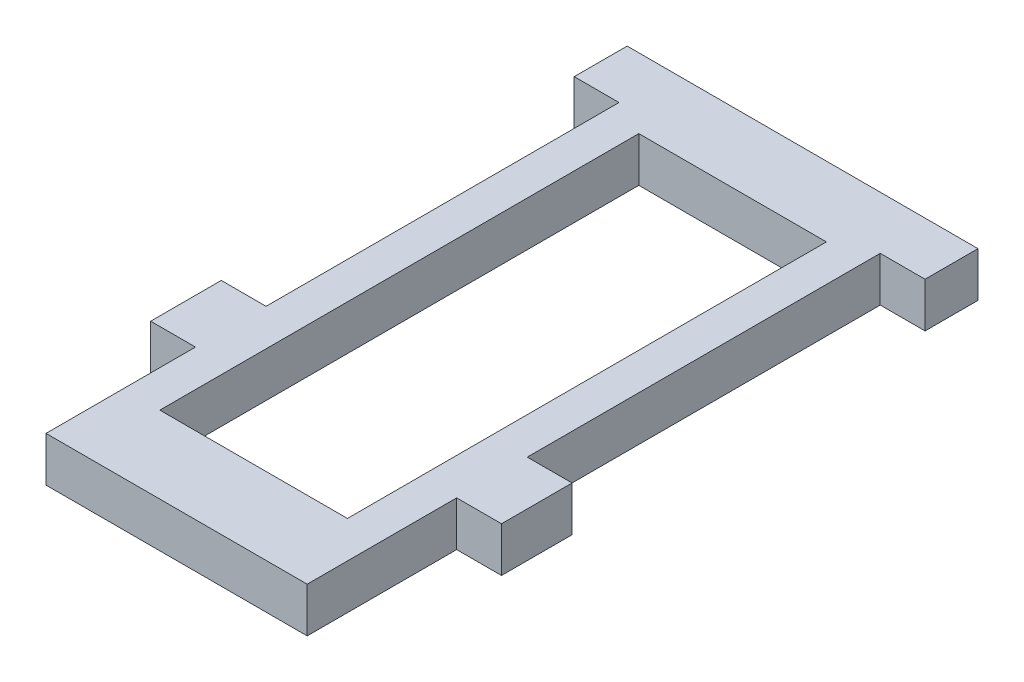
ISO-10303-21;
HEADER;
FILE_DESCRIPTION(('STEP AP214'),'2;1');
FILE_NAME('part.step','',(''),(''),'','','');
FILE_SCHEMA(('AUTOMOTIVE_DESIGN { 1 0 10303 214 1 1 1 1 }'));
ENDSEC;
DATA;
#1=APPLICATION_CONTEXT('core data for automotive mechanical design processes');
#2=APPLICATION_PROTOCOL_DEFINITION('international standard','automotive_design',2000,#1);
#3=PRODUCT_CONTEXT('',#1,'mechanical');
#4=PRODUCT('Part','Part','',(#3));
#5=PRODUCT_RELATED_PRODUCT_CATEGORY('part','',(#4));
#6=PRODUCT_DEFINITION_FORMATION('','',#4);
#7=PRODUCT_DEFINITION_CONTEXT('part definition',#1,'design');
#8=PRODUCT_DEFINITION('design','',#6,#7);
#9=PRODUCT_DEFINITION_SHAPE('','',#8);
#10=(LENGTH_UNIT() NAMED_UNIT(*) SI_UNIT(.MILLI.,.METRE.));
#11=(NAMED_UNIT(*) PLANE_ANGLE_UNIT() SI_UNIT($,.RADIAN.));
#12=(NAMED_UNIT(*) SI_UNIT($,.STERADIAN.) SOLID_ANGLE_UNIT());
#13=UNCERTAINTY_MEASURE_WITH_UNIT(LENGTH_MEASURE(1.E-05),#10,'distance_accuracy_value','');
#14=(GEOMETRIC_REPRESENTATION_CONTEXT(3) GLOBAL_UNCERTAINTY_ASSIGNED_CONTEXT((#13)) GLOBAL_UNIT_ASSIGNED_CONTEXT((#10,
#11,#12)) REPRESENTATION_CONTEXT('',''));
#15=CARTESIAN_POINT('',(0.,0.,0.));
#16=DIRECTION('',(0.,0.,1.));
#17=DIRECTION('',(1.,0.,0.));
#18=AXIS2_PLACEMENT_3D('',#15,#16,#17);
#19=CARTESIAN_POINT('',(0.,6.35,0.));
#20=DIRECTION('',(0.,-1.,0.));
#21=DIRECTION('',(0.,0.,-1.));
#22=AXIS2_PLACEMENT_3D('',#19,#20,#21);
#23=PLANE('',#22);
#24=DIRECTION('',(1.,0.,0.));
#25=VECTOR('',#24,1.);
#26=CARTESIAN_POINT('',(37.,6.35,88.675));
#27=LINE('',#26,#25);
#28=CARTESIAN_POINT('',(-37.,6.35,88.675));
#29=VERTEX_POINT('',#28);
#30=CARTESIAN_POINT('',(37.,6.35,88.675));
#31=VERTEX_POINT('',#30);
#32=EDGE_CURVE('E206',#29,#31,#27,.T.);
#33=ORIENTED_EDGE('',*,*,#32,.T.);
#34=DIRECTION('',(0.,0.,-1.));
#35=VECTOR('',#34,1.);
#36=CARTESIAN_POINT('',(37.,6.35,46.325));
#37=LINE('',#36,#35);
#38=CARTESIAN_POINT('',(37.,6.35,46.325));
#39=VERTEX_POINT('',#38);
#40=EDGE_CURVE('E209',#31,#39,#37,.T.);
#41=ORIENTED_EDGE('',*,*,#40,.T.);
#42=DIRECTION('',(1.,0.,0.));
#43=VECTOR('',#42,1.);
#44=CARTESIAN_POINT('',(49.7,6.35,46.325));
#45=LINE('',#44,#43);
#46=CARTESIAN_POINT('',(49.7,6.35,46.325));
#47=VERTEX_POINT('',#46);
#48=EDGE_CURVE('E212',#39,#47,#45,.T.);
#49=ORIENTED_EDGE('',*,*,#48,.T.);
#50=DIRECTION('',(0.,0.,-1.));
#51=VECTOR('',#50,1.);
#52=CARTESIAN_POINT('',(49.7,6.35,26.325));
#53=LINE('',#52,#51);
#54=CARTESIAN_POINT('',(49.7,6.35,26.325));
#55=VERTEX_POINT('',#54);
#56=EDGE_CURVE('E214',#47,#55,#53,.T.);
#57=ORIENTED_EDGE('',*,*,#56,.T.);
#58=DIRECTION('',(-1.,0.,0.));
#59=VECTOR('',#58,1.);
#60=CARTESIAN_POINT('',(37.,6.35,26.325));
#61=LINE('',#60,#59);
#62=CARTESIAN_POINT('',(37.,6.35,26.325));
#63=VERTEX_POINT('',#62);
#64=EDGE_CURVE('E216',#55,#63,#61,.T.);
#65=ORIENTED_EDGE('',*,*,#64,.T.);
#66=DIRECTION('',(0.,0.,-1.));
#67=VECTOR('',#66,1.);
#68=CARTESIAN_POINT('',(37.,6.35,-73.675));
#69=LINE('',#68,#67);
#70=CARTESIAN_POINT('',(37.,6.35,-73.675));
#71=VERTEX_POINT('',#70);
#72=EDGE_CURVE('E218',#63,#71,#69,.T.);
#73=ORIENTED_EDGE('',*,*,#72,.T.);
#74=DIRECTION('',(1.,0.,0.));
#75=VECTOR('',#74,1.);
#76=CARTESIAN_POINT('',(49.7,6.35,-73.675));
#77=LINE('',#76,#75);
#78=CARTESIAN_POINT('',(49.7,6.35,-73.675));
#79=VERTEX_POINT('',#78);
#80=EDGE_CURVE('E220',#71,#79,#77,.T.);
#81=ORIENTED_EDGE('',*,*,#80,.T.);
#82=DIRECTION('',(0.,0.,-1.));
#83=VECTOR('',#82,1.);
#84=CARTESIAN_POINT('',(49.7,6.35,-88.675));
#85=LINE('',#84,#83);
#86=CARTESIAN_POINT('',(49.7,6.35,-88.675));
#87=VERTEX_POINT('',#86);
#88=EDGE_CURVE('E222',#79,#87,#85,.T.);
#89=ORIENTED_EDGE('',*,*,#88,.T.);
#90=DIRECTION('',(-1.,0.,0.));
#91=VECTOR('',#90,1.);
#92=CARTESIAN_POINT('',(-49.7,6.35,-88.675));
#93=LINE('',#92,#91);
#94=CARTESIAN_POINT('',(-49.7,6.35,-88.675));
#95=VERTEX_POINT('',#94);
#96=EDGE_CURVE('E224',#87,#95,#93,.T.);
#97=ORIENTED_EDGE('',*,*,#96,.T.);
#98=DIRECTION('',(0.,0.,1.));
#99=VECTOR('',#98,1.);
#100=CARTESIAN_POINT('',(-49.7,6.35,-73.675));
#101=LINE('',#100,#99);
#102=CARTESIAN_POINT('',(-49.7,6.35,-73.675));
#103=VERTEX_POINT('',#102);
#104=EDGE_CURVE('E226',#95,#103,#101,.T.);
#105=ORIENTED_EDGE('',*,*,#104,.T.);
#106=DIRECTION('',(1.,0.,0.));
#107=VECTOR('',#106,1.);
#108=CARTESIAN_POINT('',(-37.,6.35,-73.675));
#109=LINE('',#108,#107);
#110=CARTESIAN_POINT('',(-37.,6.35,-73.675));
#111=VERTEX_POINT('',#110);
#112=EDGE_CURVE('E228',#103,#111,#109,.T.);
#113=ORIENTED_EDGE('',*,*,#112,.T.);
#114=DIRECTION('',(0.,0.,1.));
#115=VECTOR('',#114,1.);
#116=CARTESIAN_POINT('',(-37.,6.35,26.325));
#117=LINE('',#116,#115);
#118=CARTESIAN_POINT('',(-37.,6.35,26.325));
#119=VERTEX_POINT('',#118);
#120=EDGE_CURVE('E230',#111,#119,#117,.T.);
#121=ORIENTED_EDGE('',*,*,#120,.T.);
#122=DIRECTION('',(-1.,0.,0.));
#123=VECTOR('',#122,1.);
#124=CARTESIAN_POINT('',(-49.7,6.35,26.325));
#125=LINE('',#124,#123);
#126=CARTESIAN_POINT('',(-49.7,6.35,26.325));
#127=VERTEX_POINT('',#126);
#128=EDGE_CURVE('E232',#119,#127,#125,.T.);
#129=ORIENTED_EDGE('',*,*,#128,.T.);
#130=DIRECTION('',(0.,0.,1.));
#131=VECTOR('',#130,1.);
#132=CARTESIAN_POINT('',(-49.7,6.35,46.325));
#133=LINE('',#132,#131);
#134=CARTESIAN_POINT('',(-49.7,6.35,46.325));
#135=VERTEX_POINT('',#134);
#136=EDGE_CURVE('E234',#127,#135,#133,.T.);
#137=ORIENTED_EDGE('',*,*,#136,.T.);
#138=DIRECTION('',(1.,0.,0.));
#139=VECTOR('',#138,1.);
#140=CARTESIAN_POINT('',(-37.,6.35,46.325));
#141=LINE('',#140,#139);
#142=CARTESIAN_POINT('',(-37.,6.35,46.325));
#143=VERTEX_POINT('',#142);
#144=EDGE_CURVE('E236',#135,#143,#141,.T.);
#145=ORIENTED_EDGE('',*,*,#144,.T.);
#146=DIRECTION('',(0.,0.,1.));
#147=VECTOR('',#146,1.);
#148=CARTESIAN_POINT('',(-37.,6.35,88.675));
#149=LINE('',#148,#147);
#150=EDGE_CURVE('E238',#143,#29,#149,.T.);
#151=ORIENTED_EDGE('',*,*,#150,.T.);
#152=EDGE_LOOP('',(#33,#41,#49,#57,#65,#73,#81,#89,#97,#105,#113,#121,#129,#137,#145,#151));
#153=FACE_BOUND('',#152,.T.);
#154=DIRECTION('',(0.,0.,1.));
#155=VECTOR('',#154,1.);
#156=CARTESIAN_POINT('',(-26.575,6.35,-68.85));
#157=LINE('',#156,#155);
#158=CARTESIAN_POINT('',(-26.575,6.35,-68.85));
#159=VERTEX_POINT('',#158);
#160=CARTESIAN_POINT('',(-26.575,6.35,66.85));
#161=VERTEX_POINT('',#160);
#162=EDGE_CURVE('E170',#159,#161,#157,.T.);
#163=ORIENTED_EDGE('',*,*,#162,.F.);
#164=DIRECTION('',(-1.,0.,0.));
#165=VECTOR('',#164,1.);
#166=CARTESIAN_POINT('',(-26.575,6.35,-68.85));
#167=LINE('',#166,#165);
#168=CARTESIAN_POINT('',(26.575,6.35,-68.85));
#169=VERTEX_POINT('',#168);
#170=EDGE_CURVE('E192',#169,#159,#167,.T.);
#171=ORIENTED_EDGE('',*,*,#170,.F.);
#172=DIRECTION('',(0.,0.,-1.));
#173=VECTOR('',#172,1.);
#174=CARTESIAN_POINT('',(26.575,6.35,-68.85));
#175=LINE('',#174,#173);
#176=CARTESIAN_POINT('',(26.575,6.35,66.85));
#177=VERTEX_POINT('',#176);
#178=EDGE_CURVE('E190',#177,#169,#175,.T.);
#179=ORIENTED_EDGE('',*,*,#178,.F.);
#180=DIRECTION('',(1.,0.,0.));
#181=VECTOR('',#180,1.);
#182=CARTESIAN_POINT('',(-26.575,6.35,66.85));
#183=LINE('',#182,#181);
#184=EDGE_CURVE('E178',#161,#177,#183,.T.);
#185=ORIENTED_EDGE('',*,*,#184,.F.);
#186=EDGE_LOOP('',(#163,#171,#179,#185));
#187=FACE_BOUND('',#186,.T.);
#188=ADVANCED_FACE('F33',(#153,#187),#23,.F.);
#189=CARTESIAN_POINT('',(0.,-6.35,0.));
#190=DIRECTION('',(0.,-1.,0.));
#191=DIRECTION('',(0.,0.,-1.));
#192=AXIS2_PLACEMENT_3D('',#189,#190,#191);
#193=PLANE('',#192);
#194=DIRECTION('',(1.,0.,0.));
#195=VECTOR('',#194,1.);
#196=CARTESIAN_POINT('',(37.,-6.35,88.675));
#197=LINE('',#196,#195);
#198=CARTESIAN_POINT('',(-37.,-6.35,88.675));
#199=VERTEX_POINT('',#198);
#200=CARTESIAN_POINT('',(37.,-6.35,88.675));
#201=VERTEX_POINT('',#200);
#202=EDGE_CURVE('E186',#199,#201,#197,.T.);
#203=ORIENTED_EDGE('',*,*,#202,.F.);
#204=DIRECTION('',(0.,0.,1.));
#205=VECTOR('',#204,1.);
#206=CARTESIAN_POINT('',(-37.,-6.35,88.675));
#207=LINE('',#206,#205);
#208=CARTESIAN_POINT('',(-37.,-6.35,46.325));
#209=VERTEX_POINT('',#208);
#210=EDGE_CURVE('E210',#209,#199,#207,.T.);
#211=ORIENTED_EDGE('',*,*,#210,.F.);
#212=DIRECTION('',(1.,0.,0.));
#213=VECTOR('',#212,1.);
#214=CARTESIAN_POINT('',(-37.,-6.35,46.325));
#215=LINE('',#214,#213);
#216=CARTESIAN_POINT('',(-49.7,-6.35,46.325));
#217=VERTEX_POINT('',#216);
#218=EDGE_CURVE('E269',#217,#209,#215,.T.);
#219=ORIENTED_EDGE('',*,*,#218,.F.);
#220=DIRECTION('',(0.,0.,1.));
#221=VECTOR('',#220,1.);
#222=CARTESIAN_POINT('',(-49.7,-6.35,46.325));
#223=LINE('',#222,#221);
#224=CARTESIAN_POINT('',(-49.7,-6.35,26.325));
#225=VERTEX_POINT('',#224);
#226=EDGE_CURVE('E267',#225,#217,#223,.T.);
#227=ORIENTED_EDGE('',*,*,#226,.F.);
#228=DIRECTION('',(-1.,0.,0.));
#229=VECTOR('',#228,1.);
#230=CARTESIAN_POINT('',(-49.7,-6.35,26.325));
#231=LINE('',#230,#229);
#232=CARTESIAN_POINT('',(-37.,-6.35,26.325));
#233=VERTEX_POINT('',#232);
#234=EDGE_CURVE('E265',#233,#225,#231,.T.);
#235=ORIENTED_EDGE('',*,*,#234,.F.);
#236=DIRECTION('',(0.,0.,1.));
#237=VECTOR('',#236,1.);
#238=CARTESIAN_POINT('',(-37.,-6.35,26.325));
#239=LINE('',#238,#237);
#240=CARTESIAN_POINT('',(-37.,-6.35,-73.675));
#241=VERTEX_POINT('',#240);
#242=EDGE_CURVE('E263',#241,#233,#239,.T.);
#243=ORIENTED_EDGE('',*,*,#242,.F.);
#244=DIRECTION('',(1.,0.,0.));
#245=VECTOR('',#244,1.);
#246=CARTESIAN_POINT('',(-37.,-6.35,-73.675));
#247=LINE('',#246,#245);
#248=CARTESIAN_POINT('',(-49.7,-6.35,-73.675));
#249=VERTEX_POINT('',#248);
#250=EDGE_CURVE('E261',#249,#241,#247,.T.);
#251=ORIENTED_EDGE('',*,*,#250,.F.);
#252=DIRECTION('',(0.,0.,1.));
#253=VECTOR('',#252,1.);
#254=CARTESIAN_POINT('',(-49.7,-6.35,-73.675));
#255=LINE('',#254,#253);
#256=CARTESIAN_POINT('',(-49.7,-6.35,-88.675));
#257=VERTEX_POINT('',#256);
#258=EDGE_CURVE('E259',#257,#249,#255,.T.);
#259=ORIENTED_EDGE('',*,*,#258,.F.);
#260=DIRECTION('',(-1.,0.,0.));
#261=VECTOR('',#260,1.);
#262=CARTESIAN_POINT('',(-49.7,-6.35,-88.675));
#263=LINE('',#262,#261);
#264=CARTESIAN_POINT('',(49.7,-6.35,-88.675));
#265=VERTEX_POINT('',#264);
#266=EDGE_CURVE('E257',#265,#257,#263,.T.);
#267=ORIENTED_EDGE('',*,*,#266,.F.);
#268=DIRECTION('',(0.,0.,-1.));
#269=VECTOR('',#268,1.);
#270=CARTESIAN_POINT('',(49.7,-6.35,-88.675));
#271=LINE('',#270,#269);
#272=CARTESIAN_POINT('',(49.7,-6.35,-73.675));
#273=VERTEX_POINT('',#272);
#274=EDGE_CURVE('E255',#273,#265,#271,.T.);
#275=ORIENTED_EDGE('',*,*,#274,.F.);
#276=DIRECTION('',(1.,0.,0.));
#277=VECTOR('',#276,1.);
#278=CARTESIAN_POINT('',(49.7,-6.35,-73.675));
#279=LINE('',#278,#277);
#280=CARTESIAN_POINT('',(37.,-6.35,-73.675));
#281=VERTEX_POINT('',#280);
#282=EDGE_CURVE('E253',#281,#273,#279,.T.);
#283=ORIENTED_EDGE('',*,*,#282,.F.);
#284=DIRECTION('',(0.,0.,-1.));
#285=VECTOR('',#284,1.);
#286=CARTESIAN_POINT('',(37.,-6.35,-73.675));
#287=LINE('',#286,#285);
#288=CARTESIAN_POINT('',(37.,-6.35,26.325));
#289=VERTEX_POINT('',#288);
#290=EDGE_CURVE('E251',#289,#281,#287,.T.);
#291=ORIENTED_EDGE('',*,*,#290,.F.);
#292=DIRECTION('',(-1.,0.,0.));
#293=VECTOR('',#292,1.);
#294=CARTESIAN_POINT('',(37.,-6.35,26.325));
#295=LINE('',#294,#293);
#296=CARTESIAN_POINT('',(49.7,-6.35,26.325));
#297=VERTEX_POINT('',#296);
#298=EDGE_CURVE('E249',#297,#289,#295,.T.);
#299=ORIENTED_EDGE('',*,*,#298,.F.);
#300=DIRECTION('',(0.,0.,-1.));
#301=VECTOR('',#300,1.);
#302=CARTESIAN_POINT('',(49.7,-6.35,26.325));
#303=LINE('',#302,#301);
#304=CARTESIAN_POINT('',(49.7,-6.35,46.325));
#305=VERTEX_POINT('',#304);
#306=EDGE_CURVE('E247',#305,#297,#303,.T.);
#307=ORIENTED_EDGE('',*,*,#306,.F.);
#308=DIRECTION('',(1.,0.,0.));
#309=VECTOR('',#308,1.);
#310=CARTESIAN_POINT('',(49.7,-6.35,46.325));
#311=LINE('',#310,#309);
#312=CARTESIAN_POINT('',(37.,-6.35,46.325));
#313=VERTEX_POINT('',#312);
#314=EDGE_CURVE('E245',#313,#305,#311,.T.);
#315=ORIENTED_EDGE('',*,*,#314,.F.);
#316=DIRECTION('',(0.,0.,-1.));
#317=VECTOR('',#316,1.);
#318=CARTESIAN_POINT('',(37.,-6.35,46.325));
#319=LINE('',#318,#317);
#320=EDGE_CURVE('E243',#201,#313,#319,.T.);
#321=ORIENTED_EDGE('',*,*,#320,.F.);
#322=EDGE_LOOP('',(#203,#211,#219,#227,#235,#243,#251,#259,#267,#275,#283,#291,#299,#307,#315,#321));
#323=FACE_BOUND('',#322,.T.);
#324=DIRECTION('',(-1.,0.,0.));
#325=VECTOR('',#324,1.);
#326=CARTESIAN_POINT('',(-26.575,-6.35,-68.85));
#327=LINE('',#326,#325);
#328=CARTESIAN_POINT('',(26.575,-6.35,-68.85));
#329=VERTEX_POINT('',#328);
#330=CARTESIAN_POINT('',(-26.575,-6.35,-68.85));
#331=VERTEX_POINT('',#330);
#332=EDGE_CURVE('E179',#329,#331,#327,.T.);
#333=ORIENTED_EDGE('',*,*,#332,.T.);
#334=DIRECTION('',(0.,0.,1.));
#335=VECTOR('',#334,1.);
#336=CARTESIAN_POINT('',(-26.575,-6.35,-68.85));
#337=LINE('',#336,#335);
#338=CARTESIAN_POINT('',(-26.575,-6.35,66.85));
#339=VERTEX_POINT('',#338);
#340=EDGE_CURVE('E56',#331,#339,#337,.T.);
#341=ORIENTED_EDGE('',*,*,#340,.T.);
#342=DIRECTION('',(1.,0.,0.));
#343=VECTOR('',#342,1.);
#344=CARTESIAN_POINT('',(-26.575,-6.35,66.85));
#345=LINE('',#344,#343);
#346=CARTESIAN_POINT('',(26.575,-6.35,66.85));
#347=VERTEX_POINT('',#346);
#348=EDGE_CURVE('E185',#339,#347,#345,.T.);
#349=ORIENTED_EDGE('',*,*,#348,.T.);
#350=DIRECTION('',(0.,0.,-1.));
#351=VECTOR('',#350,1.);
#352=CARTESIAN_POINT('',(26.575,-6.35,-68.85));
#353=LINE('',#352,#351);
#354=EDGE_CURVE('E198',#347,#329,#353,.T.);
#355=ORIENTED_EDGE('',*,*,#354,.T.);
#356=EDGE_LOOP('',(#333,#341,#349,#355));
#357=FACE_BOUND('',#356,.T.);
#358=ADVANCED_FACE('F323',(#323,#357),#193,.T.);
#359=CARTESIAN_POINT('',(37.,6.35,88.675));
#360=DIRECTION('',(0.,0.,-1.));
#361=DIRECTION('',(-1.,0.,0.));
#362=AXIS2_PLACEMENT_3D('',#359,#360,#361);
#363=PLANE('',#362);
#364=ORIENTED_EDGE('',*,*,#202,.T.);
#365=DIRECTION('',(0.,-1.,0.));
#366=VECTOR('',#365,1.);
#367=CARTESIAN_POINT('',(37.,6.35,88.675));
#368=LINE('',#367,#366);
#369=EDGE_CURVE('E11',#31,#201,#368,.T.);
#370=ORIENTED_EDGE('',*,*,#369,.F.);
#371=ORIENTED_EDGE('',*,*,#32,.F.);
#372=DIRECTION('',(0.,-1.,0.));
#373=VECTOR('',#372,1.);
#374=CARTESIAN_POINT('',(-37.,6.35,88.675));
#375=LINE('',#374,#373);
#376=EDGE_CURVE('E240',#29,#199,#375,.T.);
#377=ORIENTED_EDGE('',*,*,#376,.T.);
#378=EDGE_LOOP('',(#364,#370,#371,#377));
#379=FACE_BOUND('',#378,.T.);
#380=ADVANCED_FACE('F35',(#379),#363,.F.);
#381=CARTESIAN_POINT('',(37.,6.35,46.325));
#382=DIRECTION('',(-1.,0.,0.));
#383=DIRECTION('',(0.,0.,1.));
#384=AXIS2_PLACEMENT_3D('',#381,#382,#383);
#385=PLANE('',#384);
#386=ORIENTED_EDGE('',*,*,#320,.T.);
#387=DIRECTION('',(0.,-1.,0.));
#388=VECTOR('',#387,1.);
#389=CARTESIAN_POINT('',(37.,6.35,46.325));
#390=LINE('',#389,#388);
#391=EDGE_CURVE('E41',#39,#313,#390,.T.);
#392=ORIENTED_EDGE('',*,*,#391,.F.);
#393=ORIENTED_EDGE('',*,*,#40,.F.);
#394=ORIENTED_EDGE('',*,*,#369,.T.);
#395=EDGE_LOOP('',(#386,#392,#393,#394));
#396=FACE_BOUND('',#395,.T.);
#397=ADVANCED_FACE('F340',(#396),#385,.F.);
#398=CARTESIAN_POINT('',(49.7,6.35,46.325));
#399=DIRECTION('',(0.,0.,-1.));
#400=DIRECTION('',(-1.,0.,0.));
#401=AXIS2_PLACEMENT_3D('',#398,#399,#400);
#402=PLANE('',#401);
#403=ORIENTED_EDGE('',*,*,#314,.T.);
#404=DIRECTION('',(0.,-1.,0.));
#405=VECTOR('',#404,1.);
#406=CARTESIAN_POINT('',(49.7,6.35,46.325));
#407=LINE('',#406,#405);
#408=EDGE_CURVE('E310',#47,#305,#407,.T.);
#409=ORIENTED_EDGE('',*,*,#408,.F.);
#410=ORIENTED_EDGE('',*,*,#48,.F.);
#411=ORIENTED_EDGE('',*,*,#391,.T.);
#412=EDGE_LOOP('',(#403,#409,#410,#411));
#413=FACE_BOUND('',#412,.T.);
#414=ADVANCED_FACE('F317',(#413),#402,.F.);
#415=CARTESIAN_POINT('',(49.7,6.35,26.325));
#416=DIRECTION('',(-1.,0.,0.));
#417=DIRECTION('',(0.,0.,1.));
#418=AXIS2_PLACEMENT_3D('',#415,#416,#417);
#419=PLANE('',#418);
#420=ORIENTED_EDGE('',*,*,#306,.T.);
#421=DIRECTION('',(0.,-1.,0.));
#422=VECTOR('',#421,1.);
#423=CARTESIAN_POINT('',(49.7,6.35,26.325));
#424=LINE('',#423,#422);
#425=EDGE_CURVE('E307',#55,#297,#424,.T.);
#426=ORIENTED_EDGE('',*,*,#425,.F.);
#427=ORIENTED_EDGE('',*,*,#56,.F.);
#428=ORIENTED_EDGE('',*,*,#408,.T.);
#429=EDGE_LOOP('',(#420,#426,#427,#428));
#430=FACE_BOUND('',#429,.T.);
#431=ADVANCED_FACE('F329',(#430),#419,.F.);
#432=CARTESIAN_POINT('',(37.,6.35,26.325));
#433=DIRECTION('',(0.,0.,1.));
#434=DIRECTION('',(1.,0.,0.));
#435=AXIS2_PLACEMENT_3D('',#432,#433,#434);
#436=PLANE('',#435);
#437=ORIENTED_EDGE('',*,*,#298,.T.);
#438=DIRECTION('',(0.,-1.,0.));
#439=VECTOR('',#438,1.);
#440=CARTESIAN_POINT('',(37.,6.35,26.325));
#441=LINE('',#440,#439);
#442=EDGE_CURVE('E304',#63,#289,#441,.T.);
#443=ORIENTED_EDGE('',*,*,#442,.F.);
#444=ORIENTED_EDGE('',*,*,#64,.F.);
#445=ORIENTED_EDGE('',*,*,#425,.T.);
#446=EDGE_LOOP('',(#437,#443,#444,#445));
#447=FACE_BOUND('',#446,.T.);
#448=ADVANCED_FACE('F333',(#447),#436,.F.);
#449=CARTESIAN_POINT('',(37.,6.35,-73.675));
#450=DIRECTION('',(-1.,0.,0.));
#451=DIRECTION('',(0.,0.,1.));
#452=AXIS2_PLACEMENT_3D('',#449,#450,#451);
#453=PLANE('',#452);
#454=ORIENTED_EDGE('',*,*,#290,.T.);
#455=DIRECTION('',(0.,-1.,0.));
#456=VECTOR('',#455,1.);
#457=CARTESIAN_POINT('',(37.,6.35,-73.675));
#458=LINE('',#457,#456);
#459=EDGE_CURVE('E301',#71,#281,#458,.T.);
#460=ORIENTED_EDGE('',*,*,#459,.F.);
#461=ORIENTED_EDGE('',*,*,#72,.F.);
#462=ORIENTED_EDGE('',*,*,#442,.T.);
#463=EDGE_LOOP('',(#454,#460,#461,#462));
#464=FACE_BOUND('',#463,.T.);
#465=ADVANCED_FACE('F393',(#464),#453,.F.);
#466=CARTESIAN_POINT('',(49.7,6.35,-73.675));
#467=DIRECTION('',(0.,0.,-1.));
#468=DIRECTION('',(-1.,0.,0.));
#469=AXIS2_PLACEMENT_3D('',#466,#467,#468);
#470=PLANE('',#469);
#471=ORIENTED_EDGE('',*,*,#282,.T.);
#472=DIRECTION('',(0.,-1.,0.));
#473=VECTOR('',#472,1.);
#474=CARTESIAN_POINT('',(49.7,6.35,-73.675));
#475=LINE('',#474,#473);
#476=EDGE_CURVE('E298',#79,#273,#475,.T.);
#477=ORIENTED_EDGE('',*,*,#476,.F.);
#478=ORIENTED_EDGE('',*,*,#80,.F.);
#479=ORIENTED_EDGE('',*,*,#459,.T.);
#480=EDGE_LOOP('',(#471,#477,#478,#479));
#481=FACE_BOUND('',#480,.T.);
#482=ADVANCED_FACE('F390',(#481),#470,.F.);
#483=CARTESIAN_POINT('',(49.7,6.35,-88.675));
#484=DIRECTION('',(-1.,0.,0.));
#485=DIRECTION('',(0.,0.,1.));
#486=AXIS2_PLACEMENT_3D('',#483,#484,#485);
#487=PLANE('',#486);
#488=ORIENTED_EDGE('',*,*,#274,.T.);
#489=DIRECTION('',(0.,-1.,0.));
#490=VECTOR('',#489,1.);
#491=CARTESIAN_POINT('',(49.7,6.35,-88.675));
#492=LINE('',#491,#490);
#493=EDGE_CURVE('E295',#87,#265,#492,.T.);
#494=ORIENTED_EDGE('',*,*,#493,.F.);
#495=ORIENTED_EDGE('',*,*,#88,.F.);
#496=ORIENTED_EDGE('',*,*,#476,.T.);
#497=EDGE_LOOP('',(#488,#494,#495,#496));
#498=FACE_BOUND('',#497,.T.);
#499=ADVANCED_FACE('F386',(#498),#487,.F.);
#500=CARTESIAN_POINT('',(-49.7,6.35,-88.675));
#501=DIRECTION('',(0.,0.,1.));
#502=DIRECTION('',(1.,0.,0.));
#503=AXIS2_PLACEMENT_3D('',#500,#501,#502);
#504=PLANE('',#503);
#505=ORIENTED_EDGE('',*,*,#266,.T.);
#506=DIRECTION('',(0.,-1.,0.));
#507=VECTOR('',#506,1.);
#508=CARTESIAN_POINT('',(-49.7,6.35,-88.675));
#509=LINE('',#508,#507);
#510=EDGE_CURVE('E292',#95,#257,#509,.T.);
#511=ORIENTED_EDGE('',*,*,#510,.F.);
#512=ORIENTED_EDGE('',*,*,#96,.F.);
#513=ORIENTED_EDGE('',*,*,#493,.T.);
#514=EDGE_LOOP('',(#505,#511,#512,#513));
#515=FACE_BOUND('',#514,.T.);
#516=ADVANCED_FACE('F382',(#515),#504,.F.);
#517=CARTESIAN_POINT('',(-49.7,6.35,-73.675));
#518=DIRECTION('',(1.,0.,0.));
#519=DIRECTION('',(0.,0.,-1.));
#520=AXIS2_PLACEMENT_3D('',#517,#518,#519);
#521=PLANE('',#520);
#522=ORIENTED_EDGE('',*,*,#258,.T.);
#523=DIRECTION('',(0.,-1.,0.));
#524=VECTOR('',#523,1.);
#525=CARTESIAN_POINT('',(-49.7,6.35,-73.675));
#526=LINE('',#525,#524);
#527=EDGE_CURVE('E289',#103,#249,#526,.T.);
#528=ORIENTED_EDGE('',*,*,#527,.F.);
#529=ORIENTED_EDGE('',*,*,#104,.F.);
#530=ORIENTED_EDGE('',*,*,#510,.T.);
#531=EDGE_LOOP('',(#522,#528,#529,#530));
#532=FACE_BOUND('',#531,.T.);
#533=ADVANCED_FACE('F377',(#532),#521,.F.);
#534=CARTESIAN_POINT('',(-37.,6.35,-73.675));
#535=DIRECTION('',(0.,0.,-1.));
#536=DIRECTION('',(-1.,0.,0.));
#537=AXIS2_PLACEMENT_3D('',#534,#535,#536);
#538=PLANE('',#537);
#539=ORIENTED_EDGE('',*,*,#250,.T.);
#540=DIRECTION('',(0.,-1.,0.));
#541=VECTOR('',#540,1.);
#542=CARTESIAN_POINT('',(-37.,6.35,-73.675));
#543=LINE('',#542,#541);
#544=EDGE_CURVE('E286',#111,#241,#543,.T.);
#545=ORIENTED_EDGE('',*,*,#544,.F.);
#546=ORIENTED_EDGE('',*,*,#112,.F.);
#547=ORIENTED_EDGE('',*,*,#527,.T.);
#548=EDGE_LOOP('',(#539,#545,#546,#547));
#549=FACE_BOUND('',#548,.T.);
#550=ADVANCED_FACE('F371',(#549),#538,.F.);
#551=CARTESIAN_POINT('',(-37.,6.35,26.325));
#552=DIRECTION('',(1.,0.,0.));
#553=DIRECTION('',(0.,0.,-1.));
#554=AXIS2_PLACEMENT_3D('',#551,#552,#553);
#555=PLANE('',#554);
#556=ORIENTED_EDGE('',*,*,#242,.T.);
#557=DIRECTION('',(0.,-1.,0.));
#558=VECTOR('',#557,1.);
#559=CARTESIAN_POINT('',(-37.,6.35,26.325));
#560=LINE('',#559,#558);
#561=EDGE_CURVE('E283',#119,#233,#560,.T.);
#562=ORIENTED_EDGE('',*,*,#561,.F.);
#563=ORIENTED_EDGE('',*,*,#120,.F.);
#564=ORIENTED_EDGE('',*,*,#544,.T.);
#565=EDGE_LOOP('',(#556,#562,#563,#564));
#566=FACE_BOUND('',#565,.T.);
#567=ADVANCED_FACE('F367',(#566),#555,.F.);
#568=CARTESIAN_POINT('',(-49.7,6.35,26.325));
#569=DIRECTION('',(0.,0.,1.));
#570=DIRECTION('',(1.,0.,0.));
#571=AXIS2_PLACEMENT_3D('',#568,#569,#570);
#572=PLANE('',#571);
#573=ORIENTED_EDGE('',*,*,#234,.T.);
#574=DIRECTION('',(0.,-1.,0.));
#575=VECTOR('',#574,1.);
#576=CARTESIAN_POINT('',(-49.7,6.35,26.325));
#577=LINE('',#576,#575);
#578=EDGE_CURVE('E280',#127,#225,#577,.T.);
#579=ORIENTED_EDGE('',*,*,#578,.F.);
#580=ORIENTED_EDGE('',*,*,#128,.F.);
#581=ORIENTED_EDGE('',*,*,#561,.T.);
#582=EDGE_LOOP('',(#573,#579,#580,#581));
#583=FACE_BOUND('',#582,.T.);
#584=ADVANCED_FACE('F362',(#583),#572,.F.);
#585=CARTESIAN_POINT('',(-49.7,6.35,46.325));
#586=DIRECTION('',(1.,0.,0.));
#587=DIRECTION('',(0.,0.,-1.));
#588=AXIS2_PLACEMENT_3D('',#585,#586,#587);
#589=PLANE('',#588);
#590=ORIENTED_EDGE('',*,*,#226,.T.);
#591=DIRECTION('',(0.,-1.,0.));
#592=VECTOR('',#591,1.);
#593=CARTESIAN_POINT('',(-49.7,6.35,46.325));
#594=LINE('',#593,#592);
#595=EDGE_CURVE('E277',#135,#217,#594,.T.);
#596=ORIENTED_EDGE('',*,*,#595,.F.);
#597=ORIENTED_EDGE('',*,*,#136,.F.);
#598=ORIENTED_EDGE('',*,*,#578,.T.);
#599=EDGE_LOOP('',(#590,#596,#597,#598));
#600=FACE_BOUND('',#599,.T.);
#601=ADVANCED_FACE('F356',(#600),#589,.F.);
#602=CARTESIAN_POINT('',(-37.,6.35,46.325));
#603=DIRECTION('',(0.,0.,-1.));
#604=DIRECTION('',(-1.,0.,0.));
#605=AXIS2_PLACEMENT_3D('',#602,#603,#604);
#606=PLANE('',#605);
#607=ORIENTED_EDGE('',*,*,#218,.T.);
#608=DIRECTION('',(0.,-1.,0.));
#609=VECTOR('',#608,1.);
#610=CARTESIAN_POINT('',(-37.,6.35,46.325));
#611=LINE('',#610,#609);
#612=EDGE_CURVE('E274',#143,#209,#611,.T.);
#613=ORIENTED_EDGE('',*,*,#612,.F.);
#614=ORIENTED_EDGE('',*,*,#144,.F.);
#615=ORIENTED_EDGE('',*,*,#595,.T.);
#616=EDGE_LOOP('',(#607,#613,#614,#615));
#617=FACE_BOUND('',#616,.T.);
#618=ADVANCED_FACE('F352',(#617),#606,.F.);
#619=CARTESIAN_POINT('',(-37.,6.35,88.675));
#620=DIRECTION('',(1.,0.,0.));
#621=DIRECTION('',(0.,0.,-1.));
#622=AXIS2_PLACEMENT_3D('',#619,#620,#621);
#623=PLANE('',#622);
#624=ORIENTED_EDGE('',*,*,#210,.T.);
#625=ORIENTED_EDGE('',*,*,#376,.F.);
#626=ORIENTED_EDGE('',*,*,#150,.F.);
#627=ORIENTED_EDGE('',*,*,#612,.T.);
#628=EDGE_LOOP('',(#624,#625,#626,#627));
#629=FACE_BOUND('',#628,.T.);
#630=ADVANCED_FACE('F347',(#629),#623,.F.);
#631=CARTESIAN_POINT('',(-26.575,6.35,-68.85));
#632=DIRECTION('',(1.,0.,0.));
#633=DIRECTION('',(0.,0.,-1.));
#634=AXIS2_PLACEMENT_3D('',#631,#632,#633);
#635=PLANE('',#634);
#636=ORIENTED_EDGE('',*,*,#340,.F.);
#637=DIRECTION('',(0.,-1.,0.));
#638=VECTOR('',#637,1.);
#639=CARTESIAN_POINT('',(-26.575,6.35,-68.85));
#640=LINE('',#639,#638);
#641=EDGE_CURVE('E174',#159,#331,#640,.T.);
#642=ORIENTED_EDGE('',*,*,#641,.F.);
#643=ORIENTED_EDGE('',*,*,#162,.T.);
#644=DIRECTION('',(0.,-1.,0.));
#645=VECTOR('',#644,1.);
#646=CARTESIAN_POINT('',(-26.575,6.35,66.85));
#647=LINE('',#646,#645);
#648=EDGE_CURVE('E173',#161,#339,#647,.T.);
#649=ORIENTED_EDGE('',*,*,#648,.T.);
#650=EDGE_LOOP('',(#636,#642,#643,#649));
#651=FACE_BOUND('',#650,.T.);
#652=ADVANCED_FACE('F172',(#651),#635,.T.);
#653=CARTESIAN_POINT('',(-26.575,6.35,66.85));
#654=DIRECTION('',(0.,0.,-1.));
#655=DIRECTION('',(-1.,0.,0.));
#656=AXIS2_PLACEMENT_3D('',#653,#654,#655);
#657=PLANE('',#656);
#658=ORIENTED_EDGE('',*,*,#348,.F.);
#659=ORIENTED_EDGE('',*,*,#648,.F.);
#660=ORIENTED_EDGE('',*,*,#184,.T.);
#661=DIRECTION('',(0.,-1.,0.));
#662=VECTOR('',#661,1.);
#663=CARTESIAN_POINT('',(26.575,6.35,66.85));
#664=LINE('',#663,#662);
#665=EDGE_CURVE('E187',#177,#347,#664,.T.);
#666=ORIENTED_EDGE('',*,*,#665,.T.);
#667=EDGE_LOOP('',(#658,#659,#660,#666));
#668=FACE_BOUND('',#667,.T.);
#669=ADVANCED_FACE('F182',(#668),#657,.T.);
#670=CARTESIAN_POINT('',(26.575,6.35,-68.85));
#671=DIRECTION('',(-1.,0.,0.));
#672=DIRECTION('',(0.,0.,1.));
#673=AXIS2_PLACEMENT_3D('',#670,#671,#672);
#674=PLANE('',#673);
#675=ORIENTED_EDGE('',*,*,#354,.F.);
#676=ORIENTED_EDGE('',*,*,#665,.F.);
#677=ORIENTED_EDGE('',*,*,#178,.T.);
#678=DIRECTION('',(0.,-1.,0.));
#679=VECTOR('',#678,1.);
#680=CARTESIAN_POINT('',(26.575,6.35,-68.85));
#681=LINE('',#680,#679);
#682=EDGE_CURVE('E48',#169,#329,#681,.T.);
#683=ORIENTED_EDGE('',*,*,#682,.T.);
#684=EDGE_LOOP('',(#675,#676,#677,#683));
#685=FACE_BOUND('',#684,.T.);
#686=ADVANCED_FACE('F475',(#685),#674,.T.);
#687=CARTESIAN_POINT('',(-26.575,6.35,-68.85));
#688=DIRECTION('',(0.,0.,1.));
#689=DIRECTION('',(1.,0.,0.));
#690=AXIS2_PLACEMENT_3D('',#687,#688,#689);
#691=PLANE('',#690);
#692=ORIENTED_EDGE('',*,*,#332,.F.);
#693=ORIENTED_EDGE('',*,*,#682,.F.);
#694=ORIENTED_EDGE('',*,*,#170,.T.);
#695=ORIENTED_EDGE('',*,*,#641,.T.);
#696=EDGE_LOOP('',(#692,#693,#694,#695));
#697=FACE_BOUND('',#696,.T.);
#698=ADVANCED_FACE('F481',(#697),#691,.T.);
#699=CLOSED_SHELL('',(#188,#358,#380,#397,#414,#431,#448,#465,#482,#499,#516,#533,#550,#567,
#584,#601,#618,#630,#652,#669,#686,#698));
#700=MANIFOLD_SOLID_BREP('B2',#699);
#701=ADVANCED_BREP_SHAPE_REPRESENTATION('',(#18,#700),#14);
#702=SHAPE_DEFINITION_REPRESENTATION(#9,#701);
ENDSEC;
END-ISO-10303-21;
